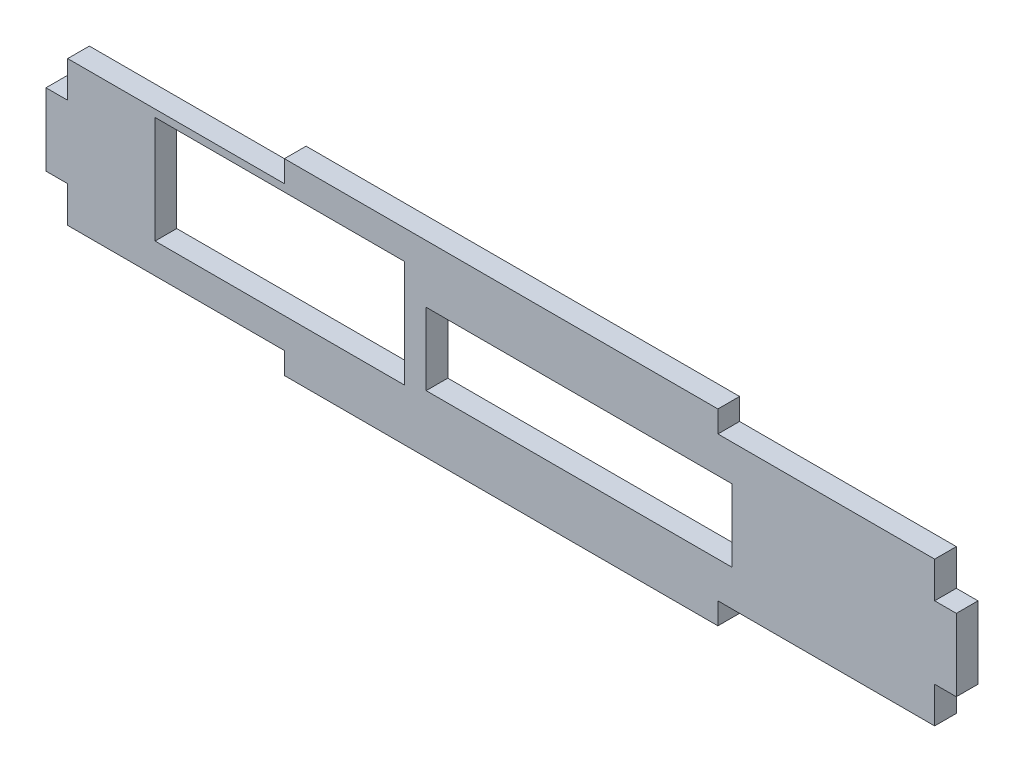
ISO-10303-21;
HEADER;
FILE_DESCRIPTION(('STEP AP214'),'2;1');
FILE_NAME('part.step','',(''),(''),'','','');
FILE_SCHEMA(('AUTOMOTIVE_DESIGN { 1 0 10303 214 1 1 1 1 }'));
ENDSEC;
DATA;
#1=APPLICATION_CONTEXT('core data for automotive mechanical design processes');
#2=APPLICATION_PROTOCOL_DEFINITION('international standard','automotive_design',2000,#1);
#3=PRODUCT_CONTEXT('',#1,'mechanical');
#4=PRODUCT('Part','Part','',(#3));
#5=PRODUCT_RELATED_PRODUCT_CATEGORY('part','',(#4));
#6=PRODUCT_DEFINITION_FORMATION('','',#4);
#7=PRODUCT_DEFINITION_CONTEXT('part definition',#1,'design');
#8=PRODUCT_DEFINITION('design','',#6,#7);
#9=PRODUCT_DEFINITION_SHAPE('','',#8);
#10=(LENGTH_UNIT() NAMED_UNIT(*) SI_UNIT(.MILLI.,.METRE.));
#11=(NAMED_UNIT(*) PLANE_ANGLE_UNIT() SI_UNIT($,.RADIAN.));
#12=(NAMED_UNIT(*) SI_UNIT($,.STERADIAN.) SOLID_ANGLE_UNIT());
#13=UNCERTAINTY_MEASURE_WITH_UNIT(LENGTH_MEASURE(1.E-05),#10,'distance_accuracy_value','');
#14=(GEOMETRIC_REPRESENTATION_CONTEXT(3) GLOBAL_UNCERTAINTY_ASSIGNED_CONTEXT((#13)) GLOBAL_UNIT_ASSIGNED_CONTEXT((#10,
#11,#12)) REPRESENTATION_CONTEXT('',''));
#15=CARTESIAN_POINT('',(0.,0.,0.));
#16=DIRECTION('',(0.,0.,1.));
#17=DIRECTION('',(1.,0.,0.));
#18=AXIS2_PLACEMENT_3D('',#15,#16,#17);
#19=CARTESIAN_POINT('',(0.,0.,3.));
#20=DIRECTION('',(0.,0.,-1.));
#21=DIRECTION('',(-1.,0.,0.));
#22=AXIS2_PLACEMENT_3D('',#19,#20,#21);
#23=PLANE('',#22);
#24=DIRECTION('',(0.,-1.,0.));
#25=VECTOR('',#24,1.);
#26=CARTESIAN_POINT('',(12.0943858002996,18.9905411749039,3.));
#27=LINE('',#26,#25);
#28=CARTESIAN_POINT('',(12.0943858002996,18.9905411749039,3.));
#29=VERTEX_POINT('',#28);
#30=CARTESIAN_POINT('',(12.0943858002996,4.17103523239039,3.));
#31=VERTEX_POINT('',#30);
#32=EDGE_CURVE('E254',#29,#31,#27,.T.);
#33=ORIENTED_EDGE('',*,*,#32,.F.);
#34=DIRECTION('',(-1.,0.,0.));
#35=VECTOR('',#34,1.);
#36=CARTESIAN_POINT('',(12.0943858002996,18.9905411749039,3.));
#37=LINE('',#36,#35);
#38=CARTESIAN_POINT('',(46.6343366584414,18.9905411749039,3.));
#39=VERTEX_POINT('',#38);
#40=EDGE_CURVE('E262',#39,#29,#37,.T.);
#41=ORIENTED_EDGE('',*,*,#40,.F.);
#42=DIRECTION('',(0.,1.,0.));
#43=VECTOR('',#42,1.);
#44=CARTESIAN_POINT('',(46.6343366584414,18.9905411749039,3.));
#45=LINE('',#44,#43);
#46=CARTESIAN_POINT('',(46.6343366584414,4.17103523239039,3.));
#47=VERTEX_POINT('',#46);
#48=EDGE_CURVE('E259',#47,#39,#45,.T.);
#49=ORIENTED_EDGE('',*,*,#48,.F.);
#50=DIRECTION('',(1.,0.,0.));
#51=VECTOR('',#50,1.);
#52=CARTESIAN_POINT('',(12.0943858002996,4.17103523239039,3.));
#53=LINE('',#52,#51);
#54=EDGE_CURVE('E256',#31,#47,#53,.T.);
#55=ORIENTED_EDGE('',*,*,#54,.F.);
#56=EDGE_LOOP('',(#33,#41,#49,#55));
#57=FACE_BOUND('',#56,.T.);
#58=DIRECTION('',(1.,0.,0.));
#59=VECTOR('',#58,1.);
#60=CARTESIAN_POINT('',(30.,0.,3.));
#61=LINE('',#60,#59);
#62=CARTESIAN_POINT('',(0.,0.,3.));
#63=VERTEX_POINT('',#62);
#64=CARTESIAN_POINT('',(30.,0.,3.));
#65=VERTEX_POINT('',#64);
#66=EDGE_CURVE('E285',#63,#65,#61,.T.);
#67=ORIENTED_EDGE('',*,*,#66,.T.);
#68=DIRECTION('',(0.,-1.,0.));
#69=VECTOR('',#68,1.);
#70=CARTESIAN_POINT('',(30.,-3.,3.));
#71=LINE('',#70,#69);
#72=CARTESIAN_POINT('',(30.,-3.,3.));
#73=VERTEX_POINT('',#72);
#74=EDGE_CURVE('E288',#65,#73,#71,.T.);
#75=ORIENTED_EDGE('',*,*,#74,.T.);
#76=DIRECTION('',(1.,0.,0.));
#77=VECTOR('',#76,1.);
#78=CARTESIAN_POINT('',(90.,-3.,3.));
#79=LINE('',#78,#77);
#80=CARTESIAN_POINT('',(90.,-3.,3.));
#81=VERTEX_POINT('',#80);
#82=EDGE_CURVE('E291',#73,#81,#79,.T.);
#83=ORIENTED_EDGE('',*,*,#82,.T.);
#84=DIRECTION('',(0.,1.,0.));
#85=VECTOR('',#84,1.);
#86=CARTESIAN_POINT('',(90.,0.,3.));
#87=LINE('',#86,#85);
#88=CARTESIAN_POINT('',(90.,0.,3.));
#89=VERTEX_POINT('',#88);
#90=EDGE_CURVE('E293',#81,#89,#87,.T.);
#91=ORIENTED_EDGE('',*,*,#90,.T.);
#92=DIRECTION('',(1.,0.,0.));
#93=VECTOR('',#92,1.);
#94=CARTESIAN_POINT('',(120.,0.,3.));
#95=LINE('',#94,#93);
#96=CARTESIAN_POINT('',(120.,0.,3.));
#97=VERTEX_POINT('',#96);
#98=EDGE_CURVE('E295',#89,#97,#95,.T.);
#99=ORIENTED_EDGE('',*,*,#98,.T.);
#100=DIRECTION('',(0.,1.,0.));
#101=VECTOR('',#100,1.);
#102=CARTESIAN_POINT('',(120.,5.00000000000001,3.));
#103=LINE('',#102,#101);
#104=CARTESIAN_POINT('',(120.,5.00000000000001,3.));
#105=VERTEX_POINT('',#104);
#106=EDGE_CURVE('E297',#97,#105,#103,.T.);
#107=ORIENTED_EDGE('',*,*,#106,.T.);
#108=DIRECTION('',(1.,0.,0.));
#109=VECTOR('',#108,1.);
#110=CARTESIAN_POINT('',(123.,5.00000000000001,3.));
#111=LINE('',#110,#109);
#112=CARTESIAN_POINT('',(123.,5.00000000000001,3.));
#113=VERTEX_POINT('',#112);
#114=EDGE_CURVE('E299',#105,#113,#111,.T.);
#115=ORIENTED_EDGE('',*,*,#114,.T.);
#116=DIRECTION('',(0.,1.,0.));
#117=VECTOR('',#116,1.);
#118=CARTESIAN_POINT('',(123.,15.,3.));
#119=LINE('',#118,#117);
#120=CARTESIAN_POINT('',(123.,15.,3.));
#121=VERTEX_POINT('',#120);
#122=EDGE_CURVE('E301',#113,#121,#119,.T.);
#123=ORIENTED_EDGE('',*,*,#122,.T.);
#124=DIRECTION('',(-1.,0.,0.));
#125=VECTOR('',#124,1.);
#126=CARTESIAN_POINT('',(120.,15.,3.));
#127=LINE('',#126,#125);
#128=CARTESIAN_POINT('',(120.,15.,3.));
#129=VERTEX_POINT('',#128);
#130=EDGE_CURVE('E303',#121,#129,#127,.T.);
#131=ORIENTED_EDGE('',*,*,#130,.T.);
#132=DIRECTION('',(0.,1.,0.));
#133=VECTOR('',#132,1.);
#134=CARTESIAN_POINT('',(120.,20.,3.));
#135=LINE('',#134,#133);
#136=CARTESIAN_POINT('',(120.,20.,3.));
#137=VERTEX_POINT('',#136);
#138=EDGE_CURVE('E305',#129,#137,#135,.T.);
#139=ORIENTED_EDGE('',*,*,#138,.T.);
#140=DIRECTION('',(-1.,0.,0.));
#141=VECTOR('',#140,1.);
#142=CARTESIAN_POINT('',(90.,20.,3.));
#143=LINE('',#142,#141);
#144=CARTESIAN_POINT('',(90.,20.,3.));
#145=VERTEX_POINT('',#144);
#146=EDGE_CURVE('E307',#137,#145,#143,.T.);
#147=ORIENTED_EDGE('',*,*,#146,.T.);
#148=DIRECTION('',(0.,1.,0.));
#149=VECTOR('',#148,1.);
#150=CARTESIAN_POINT('',(90.,23.,3.));
#151=LINE('',#150,#149);
#152=CARTESIAN_POINT('',(90.,23.,3.));
#153=VERTEX_POINT('',#152);
#154=EDGE_CURVE('E309',#145,#153,#151,.T.);
#155=ORIENTED_EDGE('',*,*,#154,.T.);
#156=DIRECTION('',(-1.,0.,0.));
#157=VECTOR('',#156,1.);
#158=CARTESIAN_POINT('',(30.,23.,3.));
#159=LINE('',#158,#157);
#160=CARTESIAN_POINT('',(30.,23.,3.));
#161=VERTEX_POINT('',#160);
#162=EDGE_CURVE('E311',#153,#161,#159,.T.);
#163=ORIENTED_EDGE('',*,*,#162,.T.);
#164=DIRECTION('',(0.,-1.,0.));
#165=VECTOR('',#164,1.);
#166=CARTESIAN_POINT('',(30.,20.,3.));
#167=LINE('',#166,#165);
#168=CARTESIAN_POINT('',(30.,20.,3.));
#169=VERTEX_POINT('',#168);
#170=EDGE_CURVE('E313',#161,#169,#167,.T.);
#171=ORIENTED_EDGE('',*,*,#170,.T.);
#172=DIRECTION('',(-1.,0.,0.));
#173=VECTOR('',#172,1.);
#174=CARTESIAN_POINT('',(0.,20.,3.));
#175=LINE('',#174,#173);
#176=CARTESIAN_POINT('',(0.,20.,3.));
#177=VERTEX_POINT('',#176);
#178=EDGE_CURVE('E315',#169,#177,#175,.T.);
#179=ORIENTED_EDGE('',*,*,#178,.T.);
#180=DIRECTION('',(0.,-1.,0.));
#181=VECTOR('',#180,1.);
#182=CARTESIAN_POINT('',(0.,15.,3.));
#183=LINE('',#182,#181);
#184=CARTESIAN_POINT('',(0.,15.,3.));
#185=VERTEX_POINT('',#184);
#186=EDGE_CURVE('E317',#177,#185,#183,.T.);
#187=ORIENTED_EDGE('',*,*,#186,.T.);
#188=DIRECTION('',(-1.,0.,0.));
#189=VECTOR('',#188,1.);
#190=CARTESIAN_POINT('',(-3.,15.,3.));
#191=LINE('',#190,#189);
#192=CARTESIAN_POINT('',(-3.,15.,3.));
#193=VERTEX_POINT('',#192);
#194=EDGE_CURVE('E319',#185,#193,#191,.T.);
#195=ORIENTED_EDGE('',*,*,#194,.T.);
#196=DIRECTION('',(0.,-1.,0.));
#197=VECTOR('',#196,1.);
#198=CARTESIAN_POINT('',(-3.,4.99999999999999,3.));
#199=LINE('',#198,#197);
#200=CARTESIAN_POINT('',(-3.,4.99999999999999,3.));
#201=VERTEX_POINT('',#200);
#202=EDGE_CURVE('E321',#193,#201,#199,.T.);
#203=ORIENTED_EDGE('',*,*,#202,.T.);
#204=DIRECTION('',(1.,0.,0.));
#205=VECTOR('',#204,1.);
#206=CARTESIAN_POINT('',(0.,4.99999999999999,3.));
#207=LINE('',#206,#205);
#208=CARTESIAN_POINT('',(0.,4.99999999999999,3.));
#209=VERTEX_POINT('',#208);
#210=EDGE_CURVE('E323',#201,#209,#207,.T.);
#211=ORIENTED_EDGE('',*,*,#210,.T.);
#212=DIRECTION('',(0.,-1.,0.));
#213=VECTOR('',#212,1.);
#214=CARTESIAN_POINT('',(0.,0.,3.));
#215=LINE('',#214,#213);
#216=EDGE_CURVE('E325',#209,#63,#215,.T.);
#217=ORIENTED_EDGE('',*,*,#216,.T.);
#218=EDGE_LOOP('',(#67,#75,#83,#91,#99,#107,#115,#123,#131,#139,#147,#155,#163,#171,#179,#187,
#195,#203,#211,#217));
#219=FACE_BOUND('',#218,.T.);
#220=DIRECTION('',(0.,-1.,0.));
#221=VECTOR('',#220,1.);
#222=CARTESIAN_POINT('',(49.6156290724891,15.,3.));
#223=LINE('',#222,#221);
#224=CARTESIAN_POINT('',(49.6156290724891,15.,3.));
#225=VERTEX_POINT('',#224);
#226=CARTESIAN_POINT('',(49.6156290724891,5.00000000000001,3.));
#227=VERTEX_POINT('',#226);
#228=EDGE_CURVE('E218',#225,#227,#223,.T.);
#229=ORIENTED_EDGE('',*,*,#228,.F.);
#230=DIRECTION('',(-1.,0.,0.));
#231=VECTOR('',#230,1.);
#232=CARTESIAN_POINT('',(49.6156290724891,15.,3.));
#233=LINE('',#232,#231);
#234=CARTESIAN_POINT('',(91.9430991942169,15.,3.));
#235=VERTEX_POINT('',#234);
#236=EDGE_CURVE('E240',#235,#225,#233,.T.);
#237=ORIENTED_EDGE('',*,*,#236,.F.);
#238=DIRECTION('',(0.,1.,0.));
#239=VECTOR('',#238,1.);
#240=CARTESIAN_POINT('',(91.9430991942169,15.,3.));
#241=LINE('',#240,#239);
#242=CARTESIAN_POINT('',(91.9430991942169,5.00000000000001,3.));
#243=VERTEX_POINT('',#242);
#244=EDGE_CURVE('E238',#243,#235,#241,.T.);
#245=ORIENTED_EDGE('',*,*,#244,.F.);
#246=DIRECTION('',(1.,0.,0.));
#247=VECTOR('',#246,1.);
#248=CARTESIAN_POINT('',(49.6156290724891,5.00000000000001,3.));
#249=LINE('',#248,#247);
#250=EDGE_CURVE('E226',#227,#243,#249,.T.);
#251=ORIENTED_EDGE('',*,*,#250,.F.);
#252=EDGE_LOOP('',(#229,#237,#245,#251));
#253=FACE_BOUND('',#252,.T.);
#254=ADVANCED_FACE('F33',(#57,#219,#253),#23,.F.);
#255=CARTESIAN_POINT('',(0.,0.,0.));
#256=DIRECTION('',(0.,0.,-1.));
#257=DIRECTION('',(-1.,0.,0.));
#258=AXIS2_PLACEMENT_3D('',#255,#256,#257);
#259=PLANE('',#258);
#260=DIRECTION('',(1.,0.,0.));
#261=VECTOR('',#260,1.);
#262=CARTESIAN_POINT('',(30.,0.,0.));
#263=LINE('',#262,#261);
#264=CARTESIAN_POINT('',(0.,0.,0.));
#265=VERTEX_POINT('',#264);
#266=CARTESIAN_POINT('',(30.,0.,0.));
#267=VERTEX_POINT('',#266);
#268=EDGE_CURVE('E284',#265,#267,#263,.T.);
#269=ORIENTED_EDGE('',*,*,#268,.F.);
#270=DIRECTION('',(0.,-1.,0.));
#271=VECTOR('',#270,1.);
#272=CARTESIAN_POINT('',(0.,0.,0.));
#273=LINE('',#272,#271);
#274=CARTESIAN_POINT('',(0.,4.99999999999999,0.));
#275=VERTEX_POINT('',#274);
#276=EDGE_CURVE('E289',#275,#265,#273,.T.);
#277=ORIENTED_EDGE('',*,*,#276,.F.);
#278=DIRECTION('',(1.,0.,0.));
#279=VECTOR('',#278,1.);
#280=CARTESIAN_POINT('',(0.,4.99999999999999,0.));
#281=LINE('',#280,#279);
#282=CARTESIAN_POINT('',(-3.,4.99999999999999,0.));
#283=VERTEX_POINT('',#282);
#284=EDGE_CURVE('E364',#283,#275,#281,.T.);
#285=ORIENTED_EDGE('',*,*,#284,.F.);
#286=DIRECTION('',(0.,-1.,0.));
#287=VECTOR('',#286,1.);
#288=CARTESIAN_POINT('',(-3.,4.99999999999999,0.));
#289=LINE('',#288,#287);
#290=CARTESIAN_POINT('',(-3.,15.,0.));
#291=VERTEX_POINT('',#290);
#292=EDGE_CURVE('E362',#291,#283,#289,.T.);
#293=ORIENTED_EDGE('',*,*,#292,.F.);
#294=DIRECTION('',(-1.,0.,0.));
#295=VECTOR('',#294,1.);
#296=CARTESIAN_POINT('',(-3.,15.,0.));
#297=LINE('',#296,#295);
#298=CARTESIAN_POINT('',(0.,15.,0.));
#299=VERTEX_POINT('',#298);
#300=EDGE_CURVE('E360',#299,#291,#297,.T.);
#301=ORIENTED_EDGE('',*,*,#300,.F.);
#302=DIRECTION('',(0.,-1.,0.));
#303=VECTOR('',#302,1.);
#304=CARTESIAN_POINT('',(0.,15.,0.));
#305=LINE('',#304,#303);
#306=CARTESIAN_POINT('',(0.,20.,0.));
#307=VERTEX_POINT('',#306);
#308=EDGE_CURVE('E358',#307,#299,#305,.T.);
#309=ORIENTED_EDGE('',*,*,#308,.F.);
#310=DIRECTION('',(-1.,0.,0.));
#311=VECTOR('',#310,1.);
#312=CARTESIAN_POINT('',(0.,20.,0.));
#313=LINE('',#312,#311);
#314=CARTESIAN_POINT('',(30.,20.,0.));
#315=VERTEX_POINT('',#314);
#316=EDGE_CURVE('E356',#315,#307,#313,.T.);
#317=ORIENTED_EDGE('',*,*,#316,.F.);
#318=DIRECTION('',(0.,-1.,0.));
#319=VECTOR('',#318,1.);
#320=CARTESIAN_POINT('',(30.,20.,0.));
#321=LINE('',#320,#319);
#322=CARTESIAN_POINT('',(30.,23.,0.));
#323=VERTEX_POINT('',#322);
#324=EDGE_CURVE('E354',#323,#315,#321,.T.);
#325=ORIENTED_EDGE('',*,*,#324,.F.);
#326=DIRECTION('',(-1.,0.,0.));
#327=VECTOR('',#326,1.);
#328=CARTESIAN_POINT('',(30.,23.,0.));
#329=LINE('',#328,#327);
#330=CARTESIAN_POINT('',(90.,23.,0.));
#331=VERTEX_POINT('',#330);
#332=EDGE_CURVE('E352',#331,#323,#329,.T.);
#333=ORIENTED_EDGE('',*,*,#332,.F.);
#334=DIRECTION('',(0.,1.,0.));
#335=VECTOR('',#334,1.);
#336=CARTESIAN_POINT('',(90.,23.,0.));
#337=LINE('',#336,#335);
#338=CARTESIAN_POINT('',(90.,20.,0.));
#339=VERTEX_POINT('',#338);
#340=EDGE_CURVE('E350',#339,#331,#337,.T.);
#341=ORIENTED_EDGE('',*,*,#340,.F.);
#342=DIRECTION('',(-1.,0.,0.));
#343=VECTOR('',#342,1.);
#344=CARTESIAN_POINT('',(90.,20.,0.));
#345=LINE('',#344,#343);
#346=CARTESIAN_POINT('',(120.,20.,0.));
#347=VERTEX_POINT('',#346);
#348=EDGE_CURVE('E348',#347,#339,#345,.T.);
#349=ORIENTED_EDGE('',*,*,#348,.F.);
#350=DIRECTION('',(0.,1.,0.));
#351=VECTOR('',#350,1.);
#352=CARTESIAN_POINT('',(120.,20.,0.));
#353=LINE('',#352,#351);
#354=CARTESIAN_POINT('',(120.,15.,0.));
#355=VERTEX_POINT('',#354);
#356=EDGE_CURVE('E346',#355,#347,#353,.T.);
#357=ORIENTED_EDGE('',*,*,#356,.F.);
#358=DIRECTION('',(-1.,0.,0.));
#359=VECTOR('',#358,1.);
#360=CARTESIAN_POINT('',(120.,15.,0.));
#361=LINE('',#360,#359);
#362=CARTESIAN_POINT('',(123.,15.,0.));
#363=VERTEX_POINT('',#362);
#364=EDGE_CURVE('E344',#363,#355,#361,.T.);
#365=ORIENTED_EDGE('',*,*,#364,.F.);
#366=DIRECTION('',(0.,1.,0.));
#367=VECTOR('',#366,1.);
#368=CARTESIAN_POINT('',(123.,15.,0.));
#369=LINE('',#368,#367);
#370=CARTESIAN_POINT('',(123.,5.00000000000001,0.));
#371=VERTEX_POINT('',#370);
#372=EDGE_CURVE('E342',#371,#363,#369,.T.);
#373=ORIENTED_EDGE('',*,*,#372,.F.);
#374=DIRECTION('',(1.,0.,0.));
#375=VECTOR('',#374,1.);
#376=CARTESIAN_POINT('',(123.,5.00000000000001,0.));
#377=LINE('',#376,#375);
#378=CARTESIAN_POINT('',(120.,5.00000000000001,0.));
#379=VERTEX_POINT('',#378);
#380=EDGE_CURVE('E340',#379,#371,#377,.T.);
#381=ORIENTED_EDGE('',*,*,#380,.F.);
#382=DIRECTION('',(0.,1.,0.));
#383=VECTOR('',#382,1.);
#384=CARTESIAN_POINT('',(120.,5.00000000000001,0.));
#385=LINE('',#384,#383);
#386=CARTESIAN_POINT('',(120.,0.,0.));
#387=VERTEX_POINT('',#386);
#388=EDGE_CURVE('E338',#387,#379,#385,.T.);
#389=ORIENTED_EDGE('',*,*,#388,.F.);
#390=DIRECTION('',(1.,0.,0.));
#391=VECTOR('',#390,1.);
#392=CARTESIAN_POINT('',(120.,0.,0.));
#393=LINE('',#392,#391);
#394=CARTESIAN_POINT('',(90.,0.,0.));
#395=VERTEX_POINT('',#394);
#396=EDGE_CURVE('E336',#395,#387,#393,.T.);
#397=ORIENTED_EDGE('',*,*,#396,.F.);
#398=DIRECTION('',(0.,1.,0.));
#399=VECTOR('',#398,1.);
#400=CARTESIAN_POINT('',(90.,0.,0.));
#401=LINE('',#400,#399);
#402=CARTESIAN_POINT('',(90.,-3.,0.));
#403=VERTEX_POINT('',#402);
#404=EDGE_CURVE('E334',#403,#395,#401,.T.);
#405=ORIENTED_EDGE('',*,*,#404,.F.);
#406=DIRECTION('',(1.,0.,0.));
#407=VECTOR('',#406,1.);
#408=CARTESIAN_POINT('',(90.,-3.,0.));
#409=LINE('',#408,#407);
#410=CARTESIAN_POINT('',(30.,-3.,0.));
#411=VERTEX_POINT('',#410);
#412=EDGE_CURVE('E332',#411,#403,#409,.T.);
#413=ORIENTED_EDGE('',*,*,#412,.F.);
#414=DIRECTION('',(0.,-1.,0.));
#415=VECTOR('',#414,1.);
#416=CARTESIAN_POINT('',(30.,-3.,0.));
#417=LINE('',#416,#415);
#418=EDGE_CURVE('E330',#267,#411,#417,.T.);
#419=ORIENTED_EDGE('',*,*,#418,.F.);
#420=EDGE_LOOP('',(#269,#277,#285,#293,#301,#309,#317,#325,#333,#341,#349,#357,#365,#373,#381,
#389,#397,#405,#413,#419));
#421=FACE_BOUND('',#420,.T.);
#422=DIRECTION('',(-1.,0.,0.));
#423=VECTOR('',#422,1.);
#424=CARTESIAN_POINT('',(12.0943858002996,18.9905411749039,0.));
#425=LINE('',#424,#423);
#426=CARTESIAN_POINT('',(46.6343366584414,18.9905411749039,0.));
#427=VERTEX_POINT('',#426);
#428=CARTESIAN_POINT('',(12.0943858002996,18.9905411749039,0.));
#429=VERTEX_POINT('',#428);
#430=EDGE_CURVE('E257',#427,#429,#425,.T.);
#431=ORIENTED_EDGE('',*,*,#430,.T.);
#432=DIRECTION('',(0.,-1.,0.));
#433=VECTOR('',#432,1.);
#434=CARTESIAN_POINT('',(12.0943858002996,18.9905411749039,0.));
#435=LINE('',#434,#433);
#436=CARTESIAN_POINT('',(12.0943858002996,4.17103523239039,0.));
#437=VERTEX_POINT('',#436);
#438=EDGE_CURVE('E234',#429,#437,#435,.T.);
#439=ORIENTED_EDGE('',*,*,#438,.T.);
#440=DIRECTION('',(1.,0.,0.));
#441=VECTOR('',#440,1.);
#442=CARTESIAN_POINT('',(12.0943858002996,4.17103523239039,0.));
#443=LINE('',#442,#441);
#444=CARTESIAN_POINT('',(46.6343366584414,4.17103523239039,0.));
#445=VERTEX_POINT('',#444);
#446=EDGE_CURVE('E267',#437,#445,#443,.T.);
#447=ORIENTED_EDGE('',*,*,#446,.T.);
#448=DIRECTION('',(0.,1.,0.));
#449=VECTOR('',#448,1.);
#450=CARTESIAN_POINT('',(46.6343366584414,18.9905411749039,0.));
#451=LINE('',#450,#449);
#452=EDGE_CURVE('E270',#445,#427,#451,.T.);
#453=ORIENTED_EDGE('',*,*,#452,.T.);
#454=EDGE_LOOP('',(#431,#439,#447,#453));
#455=FACE_BOUND('',#454,.T.);
#456=DIRECTION('',(-1.,0.,0.));
#457=VECTOR('',#456,1.);
#458=CARTESIAN_POINT('',(49.6156290724891,15.,0.));
#459=LINE('',#458,#457);
#460=CARTESIAN_POINT('',(91.9430991942169,15.,0.));
#461=VERTEX_POINT('',#460);
#462=CARTESIAN_POINT('',(49.6156290724891,15.,0.));
#463=VERTEX_POINT('',#462);
#464=EDGE_CURVE('E227',#461,#463,#459,.T.);
#465=ORIENTED_EDGE('',*,*,#464,.T.);
#466=DIRECTION('',(0.,-1.,0.));
#467=VECTOR('',#466,1.);
#468=CARTESIAN_POINT('',(49.6156290724891,15.,0.));
#469=LINE('',#468,#467);
#470=CARTESIAN_POINT('',(49.6156290724891,5.00000000000001,0.));
#471=VERTEX_POINT('',#470);
#472=EDGE_CURVE('E56',#463,#471,#469,.T.);
#473=ORIENTED_EDGE('',*,*,#472,.T.);
#474=DIRECTION('',(1.,0.,0.));
#475=VECTOR('',#474,1.);
#476=CARTESIAN_POINT('',(49.6156290724891,5.00000000000001,0.));
#477=LINE('',#476,#475);
#478=CARTESIAN_POINT('',(91.9430991942169,5.00000000000001,0.));
#479=VERTEX_POINT('',#478);
#480=EDGE_CURVE('E233',#471,#479,#477,.T.);
#481=ORIENTED_EDGE('',*,*,#480,.T.);
#482=DIRECTION('',(0.,1.,0.));
#483=VECTOR('',#482,1.);
#484=CARTESIAN_POINT('',(91.9430991942169,15.,0.));
#485=LINE('',#484,#483);
#486=EDGE_CURVE('E246',#479,#461,#485,.T.);
#487=ORIENTED_EDGE('',*,*,#486,.T.);
#488=EDGE_LOOP('',(#465,#473,#481,#487));
#489=FACE_BOUND('',#488,.T.);
#490=ADVANCED_FACE('F430',(#421,#455,#489),#259,.T.);
#491=CARTESIAN_POINT('',(30.,0.,3.));
#492=DIRECTION('',(0.,1.,0.));
#493=DIRECTION('',(-1.,0.,0.));
#494=AXIS2_PLACEMENT_3D('',#491,#492,#493);
#495=PLANE('',#494);
#496=ORIENTED_EDGE('',*,*,#268,.T.);
#497=DIRECTION('',(0.,0.,-1.));
#498=VECTOR('',#497,1.);
#499=CARTESIAN_POINT('',(30.,0.,3.));
#500=LINE('',#499,#498);
#501=EDGE_CURVE('E11',#65,#267,#500,.T.);
#502=ORIENTED_EDGE('',*,*,#501,.F.);
#503=ORIENTED_EDGE('',*,*,#66,.F.);
#504=DIRECTION('',(0.,0.,-1.));
#505=VECTOR('',#504,1.);
#506=CARTESIAN_POINT('',(0.,0.,3.));
#507=LINE('',#506,#505);
#508=EDGE_CURVE('E327',#63,#265,#507,.T.);
#509=ORIENTED_EDGE('',*,*,#508,.T.);
#510=EDGE_LOOP('',(#496,#502,#503,#509));
#511=FACE_BOUND('',#510,.T.);
#512=ADVANCED_FACE('F35',(#511),#495,.F.);
#513=CARTESIAN_POINT('',(30.,-3.,3.));
#514=DIRECTION('',(1.,0.,0.));
#515=DIRECTION('',(0.,0.,-1.));
#516=AXIS2_PLACEMENT_3D('',#513,#514,#515);
#517=PLANE('',#516);
#518=ORIENTED_EDGE('',*,*,#418,.T.);
#519=DIRECTION('',(0.,0.,-1.));
#520=VECTOR('',#519,1.);
#521=CARTESIAN_POINT('',(30.,-3.,3.));
#522=LINE('',#521,#520);
#523=EDGE_CURVE('E41',#73,#411,#522,.T.);
#524=ORIENTED_EDGE('',*,*,#523,.F.);
#525=ORIENTED_EDGE('',*,*,#74,.F.);
#526=ORIENTED_EDGE('',*,*,#501,.T.);
#527=EDGE_LOOP('',(#518,#524,#525,#526));
#528=FACE_BOUND('',#527,.T.);
#529=ADVANCED_FACE('F447',(#528),#517,.F.);
#530=CARTESIAN_POINT('',(90.,-3.,3.));
#531=DIRECTION('',(0.,1.,0.));
#532=DIRECTION('',(-1.,0.,0.));
#533=AXIS2_PLACEMENT_3D('',#530,#531,#532);
#534=PLANE('',#533);
#535=ORIENTED_EDGE('',*,*,#412,.T.);
#536=DIRECTION('',(0.,0.,-1.));
#537=VECTOR('',#536,1.);
#538=CARTESIAN_POINT('',(90.,-3.,3.));
#539=LINE('',#538,#537);
#540=EDGE_CURVE('E417',#81,#403,#539,.T.);
#541=ORIENTED_EDGE('',*,*,#540,.F.);
#542=ORIENTED_EDGE('',*,*,#82,.F.);
#543=ORIENTED_EDGE('',*,*,#523,.T.);
#544=EDGE_LOOP('',(#535,#541,#542,#543));
#545=FACE_BOUND('',#544,.T.);
#546=ADVANCED_FACE('F424',(#545),#534,.F.);
#547=CARTESIAN_POINT('',(90.,0.,3.));
#548=DIRECTION('',(-1.,0.,0.));
#549=DIRECTION('',(0.,0.,1.));
#550=AXIS2_PLACEMENT_3D('',#547,#548,#549);
#551=PLANE('',#550);
#552=ORIENTED_EDGE('',*,*,#404,.T.);
#553=DIRECTION('',(0.,0.,-1.));
#554=VECTOR('',#553,1.);
#555=CARTESIAN_POINT('',(90.,0.,3.));
#556=LINE('',#555,#554);
#557=EDGE_CURVE('E414',#89,#395,#556,.T.);
#558=ORIENTED_EDGE('',*,*,#557,.F.);
#559=ORIENTED_EDGE('',*,*,#90,.F.);
#560=ORIENTED_EDGE('',*,*,#540,.T.);
#561=EDGE_LOOP('',(#552,#558,#559,#560));
#562=FACE_BOUND('',#561,.T.);
#563=ADVANCED_FACE('F436',(#562),#551,.F.);
#564=CARTESIAN_POINT('',(120.,0.,3.));
#565=DIRECTION('',(0.,1.,0.));
#566=DIRECTION('',(0.,0.,1.));
#567=AXIS2_PLACEMENT_3D('',#564,#565,#566);
#568=PLANE('',#567);
#569=ORIENTED_EDGE('',*,*,#396,.T.);
#570=DIRECTION('',(0.,0.,-1.));
#571=VECTOR('',#570,1.);
#572=CARTESIAN_POINT('',(120.,0.,3.));
#573=LINE('',#572,#571);
#574=EDGE_CURVE('E411',#97,#387,#573,.T.);
#575=ORIENTED_EDGE('',*,*,#574,.F.);
#576=ORIENTED_EDGE('',*,*,#98,.F.);
#577=ORIENTED_EDGE('',*,*,#557,.T.);
#578=EDGE_LOOP('',(#569,#575,#576,#577));
#579=FACE_BOUND('',#578,.T.);
#580=ADVANCED_FACE('F440',(#579),#568,.F.);
#581=CARTESIAN_POINT('',(120.,5.00000000000001,3.));
#582=DIRECTION('',(-1.,0.,0.));
#583=DIRECTION('',(0.,0.,1.));
#584=AXIS2_PLACEMENT_3D('',#581,#582,#583);
#585=PLANE('',#584);
#586=ORIENTED_EDGE('',*,*,#388,.T.);
#587=DIRECTION('',(0.,0.,-1.));
#588=VECTOR('',#587,1.);
#589=CARTESIAN_POINT('',(120.,5.00000000000001,3.));
#590=LINE('',#589,#588);
#591=EDGE_CURVE('E408',#105,#379,#590,.T.);
#592=ORIENTED_EDGE('',*,*,#591,.F.);
#593=ORIENTED_EDGE('',*,*,#106,.F.);
#594=ORIENTED_EDGE('',*,*,#574,.T.);
#595=EDGE_LOOP('',(#586,#592,#593,#594));
#596=FACE_BOUND('',#595,.T.);
#597=ADVANCED_FACE('F520',(#596),#585,.F.);
#598=CARTESIAN_POINT('',(123.,5.00000000000001,3.));
#599=DIRECTION('',(0.,1.,0.));
#600=DIRECTION('',(-1.,0.,0.));
#601=AXIS2_PLACEMENT_3D('',#598,#599,#600);
#602=PLANE('',#601);
#603=ORIENTED_EDGE('',*,*,#380,.T.);
#604=DIRECTION('',(0.,0.,-1.));
#605=VECTOR('',#604,1.);
#606=CARTESIAN_POINT('',(123.,5.00000000000001,3.));
#607=LINE('',#606,#605);
#608=EDGE_CURVE('E405',#113,#371,#607,.T.);
#609=ORIENTED_EDGE('',*,*,#608,.F.);
#610=ORIENTED_EDGE('',*,*,#114,.F.);
#611=ORIENTED_EDGE('',*,*,#591,.T.);
#612=EDGE_LOOP('',(#603,#609,#610,#611));
#613=FACE_BOUND('',#612,.T.);
#614=ADVANCED_FACE('F518',(#613),#602,.F.);
#615=CARTESIAN_POINT('',(123.,15.,3.));
#616=DIRECTION('',(-1.,0.,0.));
#617=DIRECTION('',(0.,0.,1.));
#618=AXIS2_PLACEMENT_3D('',#615,#616,#617);
#619=PLANE('',#618);
#620=ORIENTED_EDGE('',*,*,#372,.T.);
#621=DIRECTION('',(0.,0.,-1.));
#622=VECTOR('',#621,1.);
#623=CARTESIAN_POINT('',(123.,15.,3.));
#624=LINE('',#623,#622);
#625=EDGE_CURVE('E402',#121,#363,#624,.T.);
#626=ORIENTED_EDGE('',*,*,#625,.F.);
#627=ORIENTED_EDGE('',*,*,#122,.F.);
#628=ORIENTED_EDGE('',*,*,#608,.T.);
#629=EDGE_LOOP('',(#620,#626,#627,#628));
#630=FACE_BOUND('',#629,.T.);
#631=ADVANCED_FACE('F513',(#630),#619,.F.);
#632=CARTESIAN_POINT('',(120.,15.,3.));
#633=DIRECTION('',(0.,-1.,0.));
#634=DIRECTION('',(0.,0.,-1.));
#635=AXIS2_PLACEMENT_3D('',#632,#633,#634);
#636=PLANE('',#635);
#637=ORIENTED_EDGE('',*,*,#364,.T.);
#638=DIRECTION('',(0.,0.,-1.));
#639=VECTOR('',#638,1.);
#640=CARTESIAN_POINT('',(120.,15.,3.));
#641=LINE('',#640,#639);
#642=EDGE_CURVE('E399',#129,#355,#641,.T.);
#643=ORIENTED_EDGE('',*,*,#642,.F.);
#644=ORIENTED_EDGE('',*,*,#130,.F.);
#645=ORIENTED_EDGE('',*,*,#625,.T.);
#646=EDGE_LOOP('',(#637,#643,#644,#645));
#647=FACE_BOUND('',#646,.T.);
#648=ADVANCED_FACE('F508',(#647),#636,.F.);
#649=CARTESIAN_POINT('',(120.,20.,3.));
#650=DIRECTION('',(-1.,0.,0.));
#651=DIRECTION('',(0.,0.,1.));
#652=AXIS2_PLACEMENT_3D('',#649,#650,#651);
#653=PLANE('',#652);
#654=ORIENTED_EDGE('',*,*,#356,.T.);
#655=DIRECTION('',(0.,0.,-1.));
#656=VECTOR('',#655,1.);
#657=CARTESIAN_POINT('',(120.,20.,3.));
#658=LINE('',#657,#656);
#659=EDGE_CURVE('E396',#137,#347,#658,.T.);
#660=ORIENTED_EDGE('',*,*,#659,.F.);
#661=ORIENTED_EDGE('',*,*,#138,.F.);
#662=ORIENTED_EDGE('',*,*,#642,.T.);
#663=EDGE_LOOP('',(#654,#660,#661,#662));
#664=FACE_BOUND('',#663,.T.);
#665=ADVANCED_FACE('F504',(#664),#653,.F.);
#666=CARTESIAN_POINT('',(90.,20.,3.));
#667=DIRECTION('',(0.,-1.,0.));
#668=DIRECTION('',(0.,0.,-1.));
#669=AXIS2_PLACEMENT_3D('',#666,#667,#668);
#670=PLANE('',#669);
#671=ORIENTED_EDGE('',*,*,#348,.T.);
#672=DIRECTION('',(0.,0.,-1.));
#673=VECTOR('',#672,1.);
#674=CARTESIAN_POINT('',(90.,20.,3.));
#675=LINE('',#674,#673);
#676=EDGE_CURVE('E393',#145,#339,#675,.T.);
#677=ORIENTED_EDGE('',*,*,#676,.F.);
#678=ORIENTED_EDGE('',*,*,#146,.F.);
#679=ORIENTED_EDGE('',*,*,#659,.T.);
#680=EDGE_LOOP('',(#671,#677,#678,#679));
#681=FACE_BOUND('',#680,.T.);
#682=ADVANCED_FACE('F499',(#681),#670,.F.);
#683=CARTESIAN_POINT('',(90.,23.,3.));
#684=DIRECTION('',(-1.,0.,0.));
#685=DIRECTION('',(0.,-1.,0.));
#686=AXIS2_PLACEMENT_3D('',#683,#684,#685);
#687=PLANE('',#686);
#688=ORIENTED_EDGE('',*,*,#340,.T.);
#689=DIRECTION('',(0.,0.,-1.));
#690=VECTOR('',#689,1.);
#691=CARTESIAN_POINT('',(90.,23.,3.));
#692=LINE('',#691,#690);
#693=EDGE_CURVE('E390',#153,#331,#692,.T.);
#694=ORIENTED_EDGE('',*,*,#693,.F.);
#695=ORIENTED_EDGE('',*,*,#154,.F.);
#696=ORIENTED_EDGE('',*,*,#676,.T.);
#697=EDGE_LOOP('',(#688,#694,#695,#696));
#698=FACE_BOUND('',#697,.T.);
#699=ADVANCED_FACE('F493',(#698),#687,.F.);
#700=CARTESIAN_POINT('',(30.,23.,3.));
#701=DIRECTION('',(0.,-1.,0.));
#702=DIRECTION('',(1.,0.,0.));
#703=AXIS2_PLACEMENT_3D('',#700,#701,#702);
#704=PLANE('',#703);
#705=ORIENTED_EDGE('',*,*,#332,.T.);
#706=DIRECTION('',(0.,0.,-1.));
#707=VECTOR('',#706,1.);
#708=CARTESIAN_POINT('',(30.,23.,3.));
#709=LINE('',#708,#707);
#710=EDGE_CURVE('E387',#161,#323,#709,.T.);
#711=ORIENTED_EDGE('',*,*,#710,.F.);
#712=ORIENTED_EDGE('',*,*,#162,.F.);
#713=ORIENTED_EDGE('',*,*,#693,.T.);
#714=EDGE_LOOP('',(#705,#711,#712,#713));
#715=FACE_BOUND('',#714,.T.);
#716=ADVANCED_FACE('F489',(#715),#704,.F.);
#717=CARTESIAN_POINT('',(30.,20.,3.));
#718=DIRECTION('',(1.,0.,0.));
#719=DIRECTION('',(0.,0.,-1.));
#720=AXIS2_PLACEMENT_3D('',#717,#718,#719);
#721=PLANE('',#720);
#722=ORIENTED_EDGE('',*,*,#324,.T.);
#723=DIRECTION('',(0.,0.,-1.));
#724=VECTOR('',#723,1.);
#725=CARTESIAN_POINT('',(30.,20.,3.));
#726=LINE('',#725,#724);
#727=EDGE_CURVE('E384',#169,#315,#726,.T.);
#728=ORIENTED_EDGE('',*,*,#727,.F.);
#729=ORIENTED_EDGE('',*,*,#170,.F.);
#730=ORIENTED_EDGE('',*,*,#710,.T.);
#731=EDGE_LOOP('',(#722,#728,#729,#730));
#732=FACE_BOUND('',#731,.T.);
#733=ADVANCED_FACE('F484',(#732),#721,.F.);
#734=CARTESIAN_POINT('',(0.,20.,3.));
#735=DIRECTION('',(0.,-1.,0.));
#736=DIRECTION('',(0.,0.,-1.));
#737=AXIS2_PLACEMENT_3D('',#734,#735,#736);
#738=PLANE('',#737);
#739=ORIENTED_EDGE('',*,*,#316,.T.);
#740=DIRECTION('',(0.,0.,-1.));
#741=VECTOR('',#740,1.);
#742=CARTESIAN_POINT('',(0.,20.,3.));
#743=LINE('',#742,#741);
#744=EDGE_CURVE('E381',#177,#307,#743,.T.);
#745=ORIENTED_EDGE('',*,*,#744,.F.);
#746=ORIENTED_EDGE('',*,*,#178,.F.);
#747=ORIENTED_EDGE('',*,*,#727,.T.);
#748=EDGE_LOOP('',(#739,#745,#746,#747));
#749=FACE_BOUND('',#748,.T.);
#750=ADVANCED_FACE('F478',(#749),#738,.F.);
#751=CARTESIAN_POINT('',(0.,15.,3.));
#752=DIRECTION('',(1.,0.,0.));
#753=DIRECTION('',(0.,1.,0.));
#754=AXIS2_PLACEMENT_3D('',#751,#752,#753);
#755=PLANE('',#754);
#756=ORIENTED_EDGE('',*,*,#308,.T.);
#757=DIRECTION('',(0.,0.,-1.));
#758=VECTOR('',#757,1.);
#759=CARTESIAN_POINT('',(0.,15.,3.));
#760=LINE('',#759,#758);
#761=EDGE_CURVE('E378',#185,#299,#760,.T.);
#762=ORIENTED_EDGE('',*,*,#761,.F.);
#763=ORIENTED_EDGE('',*,*,#186,.F.);
#764=ORIENTED_EDGE('',*,*,#744,.T.);
#765=EDGE_LOOP('',(#756,#762,#763,#764));
#766=FACE_BOUND('',#765,.T.);
#767=ADVANCED_FACE('F474',(#766),#755,.F.);
#768=CARTESIAN_POINT('',(-3.,15.,3.));
#769=DIRECTION('',(0.,-1.,0.));
#770=DIRECTION('',(0.,0.,-1.));
#771=AXIS2_PLACEMENT_3D('',#768,#769,#770);
#772=PLANE('',#771);
#773=ORIENTED_EDGE('',*,*,#300,.T.);
#774=DIRECTION('',(0.,0.,-1.));
#775=VECTOR('',#774,1.);
#776=CARTESIAN_POINT('',(-3.,15.,3.));
#777=LINE('',#776,#775);
#778=EDGE_CURVE('E375',#193,#291,#777,.T.);
#779=ORIENTED_EDGE('',*,*,#778,.F.);
#780=ORIENTED_EDGE('',*,*,#194,.F.);
#781=ORIENTED_EDGE('',*,*,#761,.T.);
#782=EDGE_LOOP('',(#773,#779,#780,#781));
#783=FACE_BOUND('',#782,.T.);
#784=ADVANCED_FACE('F469',(#783),#772,.F.);
#785=CARTESIAN_POINT('',(-3.,4.99999999999999,3.));
#786=DIRECTION('',(1.,0.,0.));
#787=DIRECTION('',(0.,1.,0.));
#788=AXIS2_PLACEMENT_3D('',#785,#786,#787);
#789=PLANE('',#788);
#790=ORIENTED_EDGE('',*,*,#292,.T.);
#791=DIRECTION('',(0.,0.,-1.));
#792=VECTOR('',#791,1.);
#793=CARTESIAN_POINT('',(-3.,4.99999999999999,3.));
#794=LINE('',#793,#792);
#795=EDGE_CURVE('E372',#201,#283,#794,.T.);
#796=ORIENTED_EDGE('',*,*,#795,.F.);
#797=ORIENTED_EDGE('',*,*,#202,.F.);
#798=ORIENTED_EDGE('',*,*,#778,.T.);
#799=EDGE_LOOP('',(#790,#796,#797,#798));
#800=FACE_BOUND('',#799,.T.);
#801=ADVANCED_FACE('F463',(#800),#789,.F.);
#802=CARTESIAN_POINT('',(0.,4.99999999999999,3.));
#803=DIRECTION('',(0.,1.,0.));
#804=DIRECTION('',(0.,0.,1.));
#805=AXIS2_PLACEMENT_3D('',#802,#803,#804);
#806=PLANE('',#805);
#807=ORIENTED_EDGE('',*,*,#284,.T.);
#808=DIRECTION('',(0.,0.,-1.));
#809=VECTOR('',#808,1.);
#810=CARTESIAN_POINT('',(0.,4.99999999999999,3.));
#811=LINE('',#810,#809);
#812=EDGE_CURVE('E369',#209,#275,#811,.T.);
#813=ORIENTED_EDGE('',*,*,#812,.F.);
#814=ORIENTED_EDGE('',*,*,#210,.F.);
#815=ORIENTED_EDGE('',*,*,#795,.T.);
#816=EDGE_LOOP('',(#807,#813,#814,#815));
#817=FACE_BOUND('',#816,.T.);
#818=ADVANCED_FACE('F459',(#817),#806,.F.);
#819=CARTESIAN_POINT('',(0.,0.,3.));
#820=DIRECTION('',(1.,0.,0.));
#821=DIRECTION('',(0.,1.,0.));
#822=AXIS2_PLACEMENT_3D('',#819,#820,#821);
#823=PLANE('',#822);
#824=ORIENTED_EDGE('',*,*,#276,.T.);
#825=ORIENTED_EDGE('',*,*,#508,.F.);
#826=ORIENTED_EDGE('',*,*,#216,.F.);
#827=ORIENTED_EDGE('',*,*,#812,.T.);
#828=EDGE_LOOP('',(#824,#825,#826,#827));
#829=FACE_BOUND('',#828,.T.);
#830=ADVANCED_FACE('F454',(#829),#823,.F.);
#831=CARTESIAN_POINT('',(12.0943858002996,18.9905411749039,3.));
#832=DIRECTION('',(1.,0.,0.));
#833=DIRECTION('',(0.,0.,-1.));
#834=AXIS2_PLACEMENT_3D('',#831,#832,#833);
#835=PLANE('',#834);
#836=ORIENTED_EDGE('',*,*,#438,.F.);
#837=DIRECTION('',(0.,0.,-1.));
#838=VECTOR('',#837,1.);
#839=CARTESIAN_POINT('',(12.0943858002996,18.9905411749039,3.));
#840=LINE('',#839,#838);
#841=EDGE_CURVE('E264',#29,#429,#840,.T.);
#842=ORIENTED_EDGE('',*,*,#841,.F.);
#843=ORIENTED_EDGE('',*,*,#32,.T.);
#844=DIRECTION('',(0.,0.,-1.));
#845=VECTOR('',#844,1.);
#846=CARTESIAN_POINT('',(12.0943858002996,4.17103523239039,3.));
#847=LINE('',#846,#845);
#848=EDGE_CURVE('E281',#31,#437,#847,.T.);
#849=ORIENTED_EDGE('',*,*,#848,.T.);
#850=EDGE_LOOP('',(#836,#842,#843,#849));
#851=FACE_BOUND('',#850,.T.);
#852=ADVANCED_FACE('F538',(#851),#835,.T.);
#853=CARTESIAN_POINT('',(12.0943858002996,4.17103523239039,3.));
#854=DIRECTION('',(0.,1.,0.));
#855=DIRECTION('',(0.,0.,1.));
#856=AXIS2_PLACEMENT_3D('',#853,#854,#855);
#857=PLANE('',#856);
#858=ORIENTED_EDGE('',*,*,#446,.F.);
#859=ORIENTED_EDGE('',*,*,#848,.F.);
#860=ORIENTED_EDGE('',*,*,#54,.T.);
#861=DIRECTION('',(0.,0.,-1.));
#862=VECTOR('',#861,1.);
#863=CARTESIAN_POINT('',(46.6343366584414,4.17103523239039,3.));
#864=LINE('',#863,#862);
#865=EDGE_CURVE('E279',#47,#445,#864,.T.);
#866=ORIENTED_EDGE('',*,*,#865,.T.);
#867=EDGE_LOOP('',(#858,#859,#860,#866));
#868=FACE_BOUND('',#867,.T.);
#869=ADVANCED_FACE('F624',(#868),#857,.T.);
#870=CARTESIAN_POINT('',(46.6343366584414,18.9905411749039,3.));
#871=DIRECTION('',(-1.,0.,0.));
#872=DIRECTION('',(0.,0.,1.));
#873=AXIS2_PLACEMENT_3D('',#870,#871,#872);
#874=PLANE('',#873);
#875=ORIENTED_EDGE('',*,*,#452,.F.);
#876=ORIENTED_EDGE('',*,*,#865,.F.);
#877=ORIENTED_EDGE('',*,*,#48,.T.);
#878=DIRECTION('',(0.,0.,-1.));
#879=VECTOR('',#878,1.);
#880=CARTESIAN_POINT('',(46.6343366584414,18.9905411749039,3.));
#881=LINE('',#880,#879);
#882=EDGE_CURVE('E277',#39,#427,#881,.T.);
#883=ORIENTED_EDGE('',*,*,#882,.T.);
#884=EDGE_LOOP('',(#875,#876,#877,#883));
#885=FACE_BOUND('',#884,.T.);
#886=ADVANCED_FACE('F631',(#885),#874,.T.);
#887=CARTESIAN_POINT('',(12.0943858002996,18.9905411749039,3.));
#888=DIRECTION('',(0.,-1.,0.));
#889=DIRECTION('',(0.,0.,-1.));
#890=AXIS2_PLACEMENT_3D('',#887,#888,#889);
#891=PLANE('',#890);
#892=ORIENTED_EDGE('',*,*,#430,.F.);
#893=ORIENTED_EDGE('',*,*,#882,.F.);
#894=ORIENTED_EDGE('',*,*,#40,.T.);
#895=ORIENTED_EDGE('',*,*,#841,.T.);
#896=EDGE_LOOP('',(#892,#893,#894,#895));
#897=FACE_BOUND('',#896,.T.);
#898=ADVANCED_FACE('F638',(#897),#891,.T.);
#899=CARTESIAN_POINT('',(49.6156290724891,15.,3.));
#900=DIRECTION('',(1.,0.,0.));
#901=DIRECTION('',(0.,0.,-1.));
#902=AXIS2_PLACEMENT_3D('',#899,#900,#901);
#903=PLANE('',#902);
#904=ORIENTED_EDGE('',*,*,#472,.F.);
#905=DIRECTION('',(0.,0.,-1.));
#906=VECTOR('',#905,1.);
#907=CARTESIAN_POINT('',(49.6156290724891,15.,3.));
#908=LINE('',#907,#906);
#909=EDGE_CURVE('E222',#225,#463,#908,.T.);
#910=ORIENTED_EDGE('',*,*,#909,.F.);
#911=ORIENTED_EDGE('',*,*,#228,.T.);
#912=DIRECTION('',(0.,0.,-1.));
#913=VECTOR('',#912,1.);
#914=CARTESIAN_POINT('',(49.6156290724891,5.00000000000001,3.));
#915=LINE('',#914,#913);
#916=EDGE_CURVE('E221',#227,#471,#915,.T.);
#917=ORIENTED_EDGE('',*,*,#916,.T.);
#918=EDGE_LOOP('',(#904,#910,#911,#917));
#919=FACE_BOUND('',#918,.T.);
#920=ADVANCED_FACE('F220',(#919),#903,.T.);
#921=CARTESIAN_POINT('',(49.6156290724891,5.00000000000001,3.));
#922=DIRECTION('',(0.,1.,0.));
#923=DIRECTION('',(0.,0.,1.));
#924=AXIS2_PLACEMENT_3D('',#921,#922,#923);
#925=PLANE('',#924);
#926=ORIENTED_EDGE('',*,*,#480,.F.);
#927=ORIENTED_EDGE('',*,*,#916,.F.);
#928=ORIENTED_EDGE('',*,*,#250,.T.);
#929=DIRECTION('',(0.,0.,-1.));
#930=VECTOR('',#929,1.);
#931=CARTESIAN_POINT('',(91.9430991942169,5.00000000000001,3.));
#932=LINE('',#931,#930);
#933=EDGE_CURVE('E235',#243,#479,#932,.T.);
#934=ORIENTED_EDGE('',*,*,#933,.T.);
#935=EDGE_LOOP('',(#926,#927,#928,#934));
#936=FACE_BOUND('',#935,.T.);
#937=ADVANCED_FACE('F230',(#936),#925,.T.);
#938=CARTESIAN_POINT('',(91.9430991942169,15.,3.));
#939=DIRECTION('',(-1.,0.,0.));
#940=DIRECTION('',(0.,0.,1.));
#941=AXIS2_PLACEMENT_3D('',#938,#939,#940);
#942=PLANE('',#941);
#943=ORIENTED_EDGE('',*,*,#486,.F.);
#944=ORIENTED_EDGE('',*,*,#933,.F.);
#945=ORIENTED_EDGE('',*,*,#244,.T.);
#946=DIRECTION('',(0.,0.,-1.));
#947=VECTOR('',#946,1.);
#948=CARTESIAN_POINT('',(91.9430991942169,15.,3.));
#949=LINE('',#948,#947);
#950=EDGE_CURVE('E48',#235,#461,#949,.T.);
#951=ORIENTED_EDGE('',*,*,#950,.T.);
#952=EDGE_LOOP('',(#943,#944,#945,#951));
#953=FACE_BOUND('',#952,.T.);
#954=ADVANCED_FACE('F659',(#953),#942,.T.);
#955=CARTESIAN_POINT('',(49.6156290724891,15.,3.));
#956=DIRECTION('',(0.,-1.,0.));
#957=DIRECTION('',(0.,0.,-1.));
#958=AXIS2_PLACEMENT_3D('',#955,#956,#957);
#959=PLANE('',#958);
#960=ORIENTED_EDGE('',*,*,#464,.F.);
#961=ORIENTED_EDGE('',*,*,#950,.F.);
#962=ORIENTED_EDGE('',*,*,#236,.T.);
#963=ORIENTED_EDGE('',*,*,#909,.T.);
#964=EDGE_LOOP('',(#960,#961,#962,#963));
#965=FACE_BOUND('',#964,.T.);
#966=ADVANCED_FACE('F666',(#965),#959,.T.);
#967=CLOSED_SHELL('',(#254,#490,#512,#529,#546,#563,#580,#597,#614,#631,#648,#665,#682,#699,
#716,#733,#750,#767,#784,#801,#818,#830,#852,#869,#886,#898,#920,#937,#954,#966));
#968=MANIFOLD_SOLID_BREP('B2',#967);
#969=ADVANCED_BREP_SHAPE_REPRESENTATION('',(#18,#968),#14);
#970=SHAPE_DEFINITION_REPRESENTATION(#9,#969);
ENDSEC;
END-ISO-10303-21;
